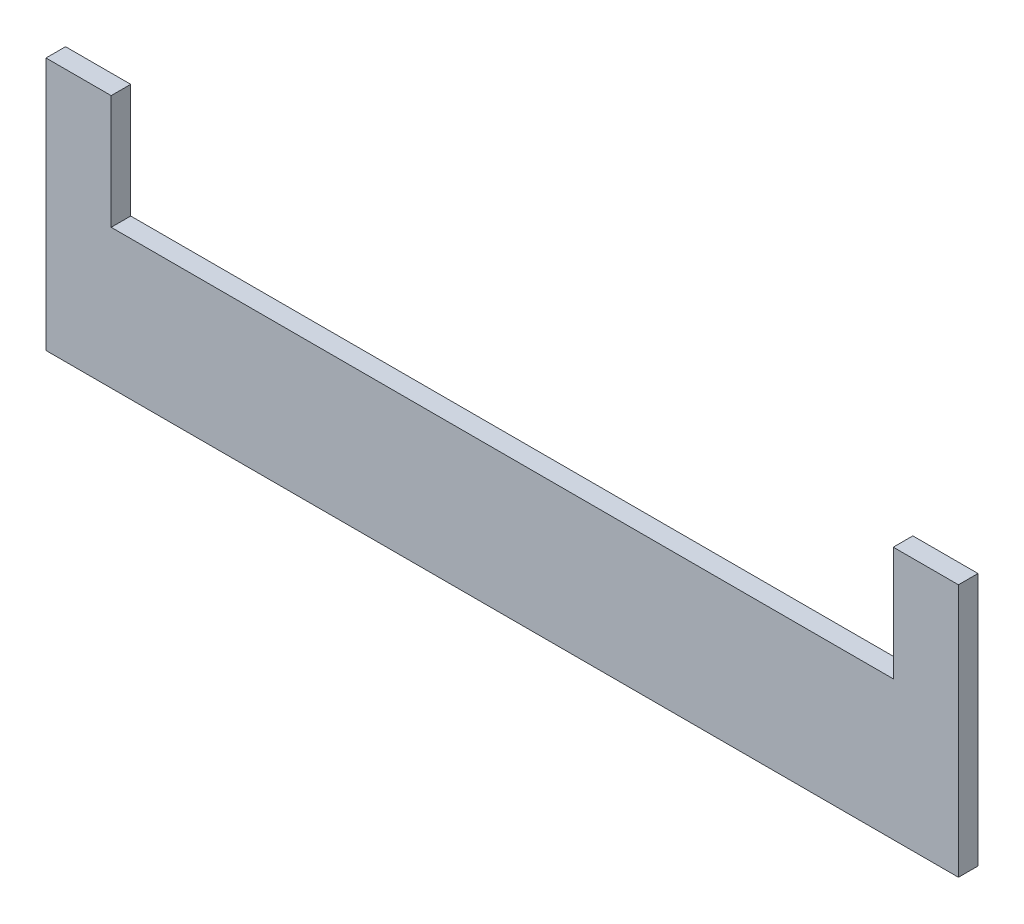
ISO-10303-21;
HEADER;
FILE_DESCRIPTION(('STEP AP214'),'2;1');
FILE_NAME('part.step','',(''),(''),'','','');
FILE_SCHEMA(('AUTOMOTIVE_DESIGN { 1 0 10303 214 1 1 1 1 }'));
ENDSEC;
DATA;
#1=APPLICATION_CONTEXT('core data for automotive mechanical design processes');
#2=APPLICATION_PROTOCOL_DEFINITION('international standard','automotive_design',2000,#1);
#3=PRODUCT_CONTEXT('',#1,'mechanical');
#4=PRODUCT('Part','Part','',(#3));
#5=PRODUCT_RELATED_PRODUCT_CATEGORY('part','',(#4));
#6=PRODUCT_DEFINITION_FORMATION('','',#4);
#7=PRODUCT_DEFINITION_CONTEXT('part definition',#1,'design');
#8=PRODUCT_DEFINITION('design','',#6,#7);
#9=PRODUCT_DEFINITION_SHAPE('','',#8);
#10=(LENGTH_UNIT() NAMED_UNIT(*) SI_UNIT(.MILLI.,.METRE.));
#11=(NAMED_UNIT(*) PLANE_ANGLE_UNIT() SI_UNIT($,.RADIAN.));
#12=(NAMED_UNIT(*) SI_UNIT($,.STERADIAN.) SOLID_ANGLE_UNIT());
#13=UNCERTAINTY_MEASURE_WITH_UNIT(LENGTH_MEASURE(1.E-05),#10,'distance_accuracy_value','');
#14=(GEOMETRIC_REPRESENTATION_CONTEXT(3) GLOBAL_UNCERTAINTY_ASSIGNED_CONTEXT((#13)) GLOBAL_UNIT_ASSIGNED_CONTEXT((#10,
#11,#12)) REPRESENTATION_CONTEXT('',''));
#15=CARTESIAN_POINT('',(0.,0.,0.));
#16=DIRECTION('',(0.,0.,1.));
#17=DIRECTION('',(1.,0.,0.));
#18=AXIS2_PLACEMENT_3D('',#15,#16,#17);
#19=CARTESIAN_POINT('',(28.,0.,1.2));
#20=DIRECTION('',(-1.,0.,0.));
#21=DIRECTION('',(0.,0.,1.));
#22=AXIS2_PLACEMENT_3D('',#19,#20,#21);
#23=PLANE('',#22);
#24=DIRECTION('',(0.,1.,0.));
#25=VECTOR('',#24,1.);
#26=CARTESIAN_POINT('',(28.,0.,0.));
#27=LINE('',#26,#25);
#28=CARTESIAN_POINT('',(28.,0.,0.));
#29=VERTEX_POINT('',#28);
#30=CARTESIAN_POINT('',(28.,15.5489795,0.));
#31=VERTEX_POINT('',#30);
#32=EDGE_CURVE('E129',#29,#31,#27,.T.);
#33=ORIENTED_EDGE('',*,*,#32,.T.);
#34=DIRECTION('',(0.,0.,-1.));
#35=VECTOR('',#34,1.);
#36=CARTESIAN_POINT('',(28.,15.5489795,1.2));
#37=LINE('',#36,#35);
#38=CARTESIAN_POINT('',(28.,15.5489795,1.2));
#39=VERTEX_POINT('',#38);
#40=EDGE_CURVE('E11',#39,#31,#37,.T.);
#41=ORIENTED_EDGE('',*,*,#40,.F.);
#42=DIRECTION('',(0.,1.,0.));
#43=VECTOR('',#42,1.);
#44=CARTESIAN_POINT('',(28.,0.,1.2));
#45=LINE('',#44,#43);
#46=CARTESIAN_POINT('',(28.,0.,1.2));
#47=VERTEX_POINT('',#46);
#48=EDGE_CURVE('E143',#47,#39,#45,.T.);
#49=ORIENTED_EDGE('',*,*,#48,.F.);
#50=DIRECTION('',(0.,0.,-1.));
#51=VECTOR('',#50,1.);
#52=CARTESIAN_POINT('',(28.,0.,1.2));
#53=LINE('',#52,#51);
#54=EDGE_CURVE('E125',#47,#29,#53,.T.);
#55=ORIENTED_EDGE('',*,*,#54,.T.);
#56=EDGE_LOOP('',(#33,#41,#49,#55));
#57=FACE_BOUND('',#56,.T.);
#58=ADVANCED_FACE('F33',(#57),#23,.F.);
#59=CARTESIAN_POINT('',(28.,15.5489795,1.2));
#60=DIRECTION('',(0.,-1.,0.));
#61=DIRECTION('',(0.,0.,-1.));
#62=AXIS2_PLACEMENT_3D('',#59,#60,#61);
#63=PLANE('',#62);
#64=DIRECTION('',(-1.,0.,0.));
#65=VECTOR('',#64,1.);
#66=CARTESIAN_POINT('',(28.,15.5489795,0.));
#67=LINE('',#66,#65);
#68=CARTESIAN_POINT('',(24.,15.5489795,0.));
#69=VERTEX_POINT('',#68);
#70=EDGE_CURVE('E132',#31,#69,#67,.T.);
#71=ORIENTED_EDGE('',*,*,#70,.T.);
#72=DIRECTION('',(0.,0.,-1.));
#73=VECTOR('',#72,1.);
#74=CARTESIAN_POINT('',(24.,15.5489795,1.2));
#75=LINE('',#74,#73);
#76=CARTESIAN_POINT('',(24.,15.5489795,1.2));
#77=VERTEX_POINT('',#76);
#78=EDGE_CURVE('E41',#77,#69,#75,.T.);
#79=ORIENTED_EDGE('',*,*,#78,.F.);
#80=DIRECTION('',(-1.,0.,0.));
#81=VECTOR('',#80,1.);
#82=CARTESIAN_POINT('',(28.,15.5489795,1.2));
#83=LINE('',#82,#81);
#84=EDGE_CURVE('E92',#39,#77,#83,.T.);
#85=ORIENTED_EDGE('',*,*,#84,.F.);
#86=ORIENTED_EDGE('',*,*,#40,.T.);
#87=EDGE_LOOP('',(#71,#79,#85,#86));
#88=FACE_BOUND('',#87,.T.);
#89=ADVANCED_FACE('F178',(#88),#63,.F.);
#90=CARTESIAN_POINT('',(24.,15.5489795,1.2));
#91=DIRECTION('',(1.,0.,0.));
#92=DIRECTION('',(0.,0.,-1.));
#93=AXIS2_PLACEMENT_3D('',#90,#91,#92);
#94=PLANE('',#93);
#95=DIRECTION('',(0.,-1.,0.));
#96=VECTOR('',#95,1.);
#97=CARTESIAN_POINT('',(24.,15.5489795,0.));
#98=LINE('',#97,#96);
#99=CARTESIAN_POINT('',(24.,8.5489795,0.));
#100=VERTEX_POINT('',#99);
#101=EDGE_CURVE('E134',#69,#100,#98,.T.);
#102=ORIENTED_EDGE('',*,*,#101,.T.);
#103=DIRECTION('',(0.,0.,-1.));
#104=VECTOR('',#103,1.);
#105=CARTESIAN_POINT('',(24.,8.5489795,1.2));
#106=LINE('',#105,#104);
#107=CARTESIAN_POINT('',(24.,8.5489795,1.2));
#108=VERTEX_POINT('',#107);
#109=EDGE_CURVE('E150',#108,#100,#106,.T.);
#110=ORIENTED_EDGE('',*,*,#109,.F.);
#111=DIRECTION('',(0.,-1.,0.));
#112=VECTOR('',#111,1.);
#113=CARTESIAN_POINT('',(24.,15.5489795,1.2));
#114=LINE('',#113,#112);
#115=EDGE_CURVE('E158',#77,#108,#114,.T.);
#116=ORIENTED_EDGE('',*,*,#115,.F.);
#117=ORIENTED_EDGE('',*,*,#78,.T.);
#118=EDGE_LOOP('',(#102,#110,#116,#117));
#119=FACE_BOUND('',#118,.T.);
#120=ADVANCED_FACE('F156',(#119),#94,.F.);
#121=CARTESIAN_POINT('',(24.,8.5489795,1.2));
#122=DIRECTION('',(0.,-1.,0.));
#123=DIRECTION('',(0.,0.,-1.));
#124=AXIS2_PLACEMENT_3D('',#121,#122,#123);
#125=PLANE('',#124);
#126=DIRECTION('',(-1.,0.,0.));
#127=VECTOR('',#126,1.);
#128=CARTESIAN_POINT('',(24.,8.5489795,0.));
#129=LINE('',#128,#127);
#130=CARTESIAN_POINT('',(-24.,8.5489795,0.));
#131=VERTEX_POINT('',#130);
#132=EDGE_CURVE('E136',#100,#131,#129,.T.);
#133=ORIENTED_EDGE('',*,*,#132,.T.);
#134=DIRECTION('',(0.,0.,-1.));
#135=VECTOR('',#134,1.);
#136=CARTESIAN_POINT('',(-24.,8.5489795,1.2));
#137=LINE('',#136,#135);
#138=CARTESIAN_POINT('',(-24.,8.5489795,1.2));
#139=VERTEX_POINT('',#138);
#140=EDGE_CURVE('E147',#139,#131,#137,.T.);
#141=ORIENTED_EDGE('',*,*,#140,.F.);
#142=DIRECTION('',(-1.,0.,0.));
#143=VECTOR('',#142,1.);
#144=CARTESIAN_POINT('',(24.,8.5489795,1.2));
#145=LINE('',#144,#143);
#146=EDGE_CURVE('E170',#108,#139,#145,.T.);
#147=ORIENTED_EDGE('',*,*,#146,.F.);
#148=ORIENTED_EDGE('',*,*,#109,.T.);
#149=EDGE_LOOP('',(#133,#141,#147,#148));
#150=FACE_BOUND('',#149,.T.);
#151=ADVANCED_FACE('F166',(#150),#125,.F.);
#152=CARTESIAN_POINT('',(-24.,15.5489795,1.2));
#153=DIRECTION('',(-1.,0.,0.));
#154=DIRECTION('',(0.,0.,1.));
#155=AXIS2_PLACEMENT_3D('',#152,#153,#154);
#156=PLANE('',#155);
#157=DIRECTION('',(0.,1.,0.));
#158=VECTOR('',#157,1.);
#159=CARTESIAN_POINT('',(-24.,15.5489795,0.));
#160=LINE('',#159,#158);
#161=CARTESIAN_POINT('',(-24.,15.5489795,0.));
#162=VERTEX_POINT('',#161);
#163=EDGE_CURVE('E138',#131,#162,#160,.T.);
#164=ORIENTED_EDGE('',*,*,#163,.T.);
#165=DIRECTION('',(0.,0.,-1.));
#166=VECTOR('',#165,1.);
#167=CARTESIAN_POINT('',(-24.,15.5489795,1.2));
#168=LINE('',#167,#166);
#169=CARTESIAN_POINT('',(-24.,15.5489795,1.2));
#170=VERTEX_POINT('',#169);
#171=EDGE_CURVE('E120',#170,#162,#168,.T.);
#172=ORIENTED_EDGE('',*,*,#171,.F.);
#173=DIRECTION('',(0.,1.,0.));
#174=VECTOR('',#173,1.);
#175=CARTESIAN_POINT('',(-24.,15.5489795,1.2));
#176=LINE('',#175,#174);
#177=EDGE_CURVE('E111',#139,#170,#176,.T.);
#178=ORIENTED_EDGE('',*,*,#177,.F.);
#179=ORIENTED_EDGE('',*,*,#140,.T.);
#180=EDGE_LOOP('',(#164,#172,#178,#179));
#181=FACE_BOUND('',#180,.T.);
#182=ADVANCED_FACE('F169',(#181),#156,.F.);
#183=CARTESIAN_POINT('',(-28.,15.5489795,1.2));
#184=DIRECTION('',(0.,-1.,0.));
#185=DIRECTION('',(0.,0.,-1.));
#186=AXIS2_PLACEMENT_3D('',#183,#184,#185);
#187=PLANE('',#186);
#188=DIRECTION('',(-1.,0.,0.));
#189=VECTOR('',#188,1.);
#190=CARTESIAN_POINT('',(-28.,15.5489795,0.));
#191=LINE('',#190,#189);
#192=CARTESIAN_POINT('',(-28.,15.5489795,0.));
#193=VERTEX_POINT('',#192);
#194=EDGE_CURVE('E119',#162,#193,#191,.T.);
#195=ORIENTED_EDGE('',*,*,#194,.T.);
#196=DIRECTION('',(0.,0.,-1.));
#197=VECTOR('',#196,1.);
#198=CARTESIAN_POINT('',(-28.,15.5489795,1.2));
#199=LINE('',#198,#197);
#200=CARTESIAN_POINT('',(-28.,15.5489795,1.2));
#201=VERTEX_POINT('',#200);
#202=EDGE_CURVE('E116',#201,#193,#199,.T.);
#203=ORIENTED_EDGE('',*,*,#202,.F.);
#204=DIRECTION('',(-1.,0.,0.));
#205=VECTOR('',#204,1.);
#206=CARTESIAN_POINT('',(-28.,15.5489795,1.2));
#207=LINE('',#206,#205);
#208=EDGE_CURVE('E105',#170,#201,#207,.T.);
#209=ORIENTED_EDGE('',*,*,#208,.F.);
#210=ORIENTED_EDGE('',*,*,#171,.T.);
#211=EDGE_LOOP('',(#195,#203,#209,#210));
#212=FACE_BOUND('',#211,.T.);
#213=ADVANCED_FACE('F117',(#212),#187,.F.);
#214=CARTESIAN_POINT('',(-28.,0.,1.2));
#215=DIRECTION('',(1.,0.,0.));
#216=DIRECTION('',(0.,0.,-1.));
#217=AXIS2_PLACEMENT_3D('',#214,#215,#216);
#218=PLANE('',#217);
#219=DIRECTION('',(0.,-1.,0.));
#220=VECTOR('',#219,1.);
#221=CARTESIAN_POINT('',(-28.,0.,0.));
#222=LINE('',#221,#220);
#223=CARTESIAN_POINT('',(-28.,0.,0.));
#224=VERTEX_POINT('',#223);
#225=EDGE_CURVE('E78',#193,#224,#222,.T.);
#226=ORIENTED_EDGE('',*,*,#225,.T.);
#227=DIRECTION('',(0.,0.,-1.));
#228=VECTOR('',#227,1.);
#229=CARTESIAN_POINT('',(-28.,0.,1.2));
#230=LINE('',#229,#228);
#231=CARTESIAN_POINT('',(-28.,0.,1.2));
#232=VERTEX_POINT('',#231);
#233=EDGE_CURVE('E121',#232,#224,#230,.T.);
#234=ORIENTED_EDGE('',*,*,#233,.F.);
#235=DIRECTION('',(0.,-1.,0.));
#236=VECTOR('',#235,1.);
#237=CARTESIAN_POINT('',(-28.,0.,1.2));
#238=LINE('',#237,#236);
#239=EDGE_CURVE('E109',#201,#232,#238,.T.);
#240=ORIENTED_EDGE('',*,*,#239,.F.);
#241=ORIENTED_EDGE('',*,*,#202,.T.);
#242=EDGE_LOOP('',(#226,#234,#240,#241));
#243=FACE_BOUND('',#242,.T.);
#244=ADVANCED_FACE('F123',(#243),#218,.F.);
#245=CARTESIAN_POINT('',(28.,0.,1.2));
#246=DIRECTION('',(0.,1.,0.));
#247=DIRECTION('',(0.,0.,1.));
#248=AXIS2_PLACEMENT_3D('',#245,#246,#247);
#249=PLANE('',#248);
#250=DIRECTION('',(1.,0.,0.));
#251=VECTOR('',#250,1.);
#252=CARTESIAN_POINT('',(28.,0.,0.));
#253=LINE('',#252,#251);
#254=EDGE_CURVE('E84',#224,#29,#253,.T.);
#255=ORIENTED_EDGE('',*,*,#254,.T.);
#256=ORIENTED_EDGE('',*,*,#54,.F.);
#257=DIRECTION('',(1.,0.,0.));
#258=VECTOR('',#257,1.);
#259=CARTESIAN_POINT('',(28.,0.,1.2));
#260=LINE('',#259,#258);
#261=EDGE_CURVE('E49',#232,#47,#260,.T.);
#262=ORIENTED_EDGE('',*,*,#261,.F.);
#263=ORIENTED_EDGE('',*,*,#233,.T.);
#264=EDGE_LOOP('',(#255,#256,#262,#263));
#265=FACE_BOUND('',#264,.T.);
#266=ADVANCED_FACE('F194',(#265),#249,.F.);
#267=CARTESIAN_POINT('',(0.,0.,1.2));
#268=DIRECTION('',(0.,0.,1.));
#269=DIRECTION('',(1.,0.,0.));
#270=AXIS2_PLACEMENT_3D('',#267,#268,#269);
#271=PLANE('',#270);
#272=ORIENTED_EDGE('',*,*,#48,.T.);
#273=ORIENTED_EDGE('',*,*,#84,.T.);
#274=ORIENTED_EDGE('',*,*,#115,.T.);
#275=ORIENTED_EDGE('',*,*,#146,.T.);
#276=ORIENTED_EDGE('',*,*,#177,.T.);
#277=ORIENTED_EDGE('',*,*,#208,.T.);
#278=ORIENTED_EDGE('',*,*,#239,.T.);
#279=ORIENTED_EDGE('',*,*,#261,.T.);
#280=EDGE_LOOP('',(#272,#273,#274,#275,#276,#277,#278,#279));
#281=FACE_BOUND('',#280,.T.);
#282=ADVANCED_FACE('F107',(#281),#271,.T.);
#283=CARTESIAN_POINT('',(0.,0.,0.));
#284=DIRECTION('',(0.,0.,1.));
#285=DIRECTION('',(1.,0.,0.));
#286=AXIS2_PLACEMENT_3D('',#283,#284,#285);
#287=PLANE('',#286);
#288=ORIENTED_EDGE('',*,*,#32,.F.);
#289=ORIENTED_EDGE('',*,*,#254,.F.);
#290=ORIENTED_EDGE('',*,*,#225,.F.);
#291=ORIENTED_EDGE('',*,*,#194,.F.);
#292=ORIENTED_EDGE('',*,*,#163,.F.);
#293=ORIENTED_EDGE('',*,*,#132,.F.);
#294=ORIENTED_EDGE('',*,*,#101,.F.);
#295=ORIENTED_EDGE('',*,*,#70,.F.);
#296=EDGE_LOOP('',(#288,#289,#290,#291,#292,#293,#294,#295));
#297=FACE_BOUND('',#296,.T.);
#298=ADVANCED_FACE('F162',(#297),#287,.F.);
#299=CLOSED_SHELL('',(#58,#89,#120,#151,#182,#213,#244,#266,#282,#298));
#300=MANIFOLD_SOLID_BREP('B2',#299);
#301=ADVANCED_BREP_SHAPE_REPRESENTATION('',(#18,#300),#14);
#302=SHAPE_DEFINITION_REPRESENTATION(#9,#301);
ENDSEC;
END-ISO-10303-21;
